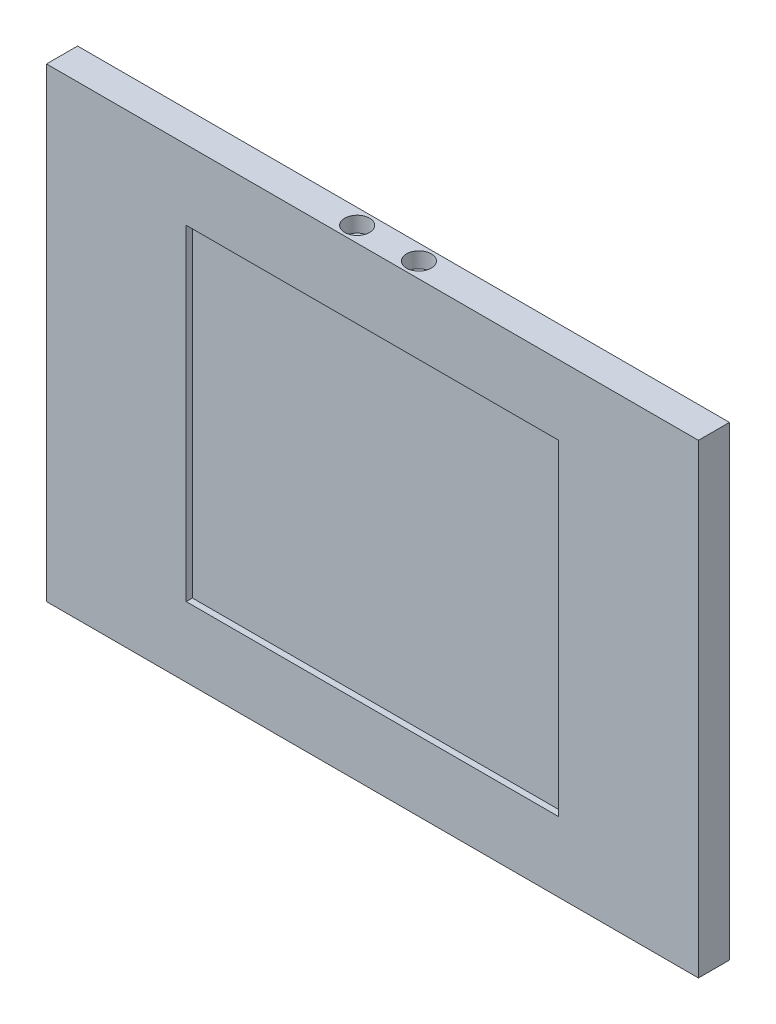
ISO-10303-21;
HEADER;
FILE_DESCRIPTION(('STEP AP214'),'2;1');
FILE_NAME('part.step','',(''),(''),'','','');
FILE_SCHEMA(('AUTOMOTIVE_DESIGN { 1 0 10303 214 1 1 1 1 }'));
ENDSEC;
DATA;
#1=APPLICATION_CONTEXT('core data for automotive mechanical design processes');
#2=APPLICATION_PROTOCOL_DEFINITION('international standard','automotive_design',2000,#1);
#3=PRODUCT_CONTEXT('',#1,'mechanical');
#4=PRODUCT('Part','Part','',(#3));
#5=PRODUCT_RELATED_PRODUCT_CATEGORY('part','',(#4));
#6=PRODUCT_DEFINITION_FORMATION('','',#4);
#7=PRODUCT_DEFINITION_CONTEXT('part definition',#1,'design');
#8=PRODUCT_DEFINITION('design','',#6,#7);
#9=PRODUCT_DEFINITION_SHAPE('','',#8);
#10=(LENGTH_UNIT() NAMED_UNIT(*) SI_UNIT(.MILLI.,.METRE.));
#11=(NAMED_UNIT(*) PLANE_ANGLE_UNIT() SI_UNIT($,.RADIAN.));
#12=(NAMED_UNIT(*) SI_UNIT($,.STERADIAN.) SOLID_ANGLE_UNIT());
#13=UNCERTAINTY_MEASURE_WITH_UNIT(LENGTH_MEASURE(1.E-05),#10,'distance_accuracy_value','');
#14=(GEOMETRIC_REPRESENTATION_CONTEXT(3) GLOBAL_UNCERTAINTY_ASSIGNED_CONTEXT((#13)) GLOBAL_UNIT_ASSIGNED_CONTEXT((#10,
#11,#12)) REPRESENTATION_CONTEXT('',''));
#15=CARTESIAN_POINT('',(0.,0.,0.));
#16=DIRECTION('',(0.,0.,1.));
#17=DIRECTION('',(1.,0.,0.));
#18=AXIS2_PLACEMENT_3D('',#15,#16,#17);
#19=CARTESIAN_POINT('',(105.,-75.,10.));
#20=DIRECTION('',(-1.,0.,0.));
#21=DIRECTION('',(0.,0.,1.));
#22=AXIS2_PLACEMENT_3D('',#19,#20,#21);
#23=PLANE('',#22);
#24=DIRECTION('',(0.,1.,0.));
#25=VECTOR('',#24,1.);
#26=CARTESIAN_POINT('',(105.,-75.,0.));
#27=LINE('',#26,#25);
#28=CARTESIAN_POINT('',(105.,-75.,0.));
#29=VERTEX_POINT('',#28);
#30=CARTESIAN_POINT('',(105.,75.,0.));
#31=VERTEX_POINT('',#30);
#32=EDGE_CURVE('E146',#29,#31,#27,.T.);
#33=ORIENTED_EDGE('',*,*,#32,.T.);
#34=DIRECTION('',(0.,0.,-1.));
#35=VECTOR('',#34,1.);
#36=CARTESIAN_POINT('',(105.,75.,10.));
#37=LINE('',#36,#35);
#38=CARTESIAN_POINT('',(105.,75.,10.));
#39=VERTEX_POINT('',#38);
#40=EDGE_CURVE('E11',#39,#31,#37,.T.);
#41=ORIENTED_EDGE('',*,*,#40,.F.);
#42=DIRECTION('',(0.,1.,0.));
#43=VECTOR('',#42,1.);
#44=CARTESIAN_POINT('',(105.,-75.,10.));
#45=LINE('',#44,#43);
#46=CARTESIAN_POINT('',(105.,-75.,10.));
#47=VERTEX_POINT('',#46);
#48=EDGE_CURVE('E150',#47,#39,#45,.T.);
#49=ORIENTED_EDGE('',*,*,#48,.F.);
#50=DIRECTION('',(0.,0.,-1.));
#51=VECTOR('',#50,1.);
#52=CARTESIAN_POINT('',(105.,-75.,10.));
#53=LINE('',#52,#51);
#54=EDGE_CURVE('E156',#47,#29,#53,.T.);
#55=ORIENTED_EDGE('',*,*,#54,.T.);
#56=EDGE_LOOP('',(#33,#41,#49,#55));
#57=FACE_BOUND('',#56,.T.);
#58=ADVANCED_FACE('F34',(#57),#23,.F.);
#59=CARTESIAN_POINT('',(-105.,75.,10.));
#60=DIRECTION('',(0.,-1.,0.));
#61=DIRECTION('',(0.,0.,-1.));
#62=AXIS2_PLACEMENT_3D('',#59,#60,#61);
#63=PLANE('',#62);
#64=CARTESIAN_POINT('',(9.94275700144992,75.,5.));
#65=DIRECTION('',(0.,1.,0.));
#66=DIRECTION('',(0.,0.,-1.));
#67=AXIS2_PLACEMENT_3D('',#64,#65,#66);
#68=CIRCLE('',#67,4.);
#69=CARTESIAN_POINT('',(9.94275700144992,75.,0.999999999999999));
#70=VERTEX_POINT('',#69);
#71=EDGE_CURVE('E201',#70,#70,#68,.T.);
#72=ORIENTED_EDGE('',*,*,#71,.F.);
#73=EDGE_LOOP('',(#72));
#74=FACE_BOUND('',#73,.T.);
#75=CARTESIAN_POINT('',(-9.94275700144992,75.,5.));
#76=DIRECTION('',(0.,1.,0.));
#77=DIRECTION('',(0.,0.,1.));
#78=AXIS2_PLACEMENT_3D('',#75,#76,#77);
#79=CIRCLE('',#78,4.);
#80=CARTESIAN_POINT('',(-9.94275700144992,75.,9.));
#81=VERTEX_POINT('',#80);
#82=EDGE_CURVE('E133',#81,#81,#79,.T.);
#83=ORIENTED_EDGE('',*,*,#82,.F.);
#84=EDGE_LOOP('',(#83));
#85=FACE_BOUND('',#84,.T.);
#86=DIRECTION('',(-1.,0.,0.));
#87=VECTOR('',#86,1.);
#88=CARTESIAN_POINT('',(-105.,75.,0.));
#89=LINE('',#88,#87);
#90=CARTESIAN_POINT('',(-105.,75.,0.));
#91=VERTEX_POINT('',#90);
#92=EDGE_CURVE('E159',#31,#91,#89,.T.);
#93=ORIENTED_EDGE('',*,*,#92,.T.);
#94=DIRECTION('',(0.,0.,-1.));
#95=VECTOR('',#94,1.);
#96=CARTESIAN_POINT('',(-105.,75.,10.));
#97=LINE('',#96,#95);
#98=CARTESIAN_POINT('',(-105.,75.,10.));
#99=VERTEX_POINT('',#98);
#100=EDGE_CURVE('E41',#99,#91,#97,.T.);
#101=ORIENTED_EDGE('',*,*,#100,.F.);
#102=DIRECTION('',(-1.,0.,0.));
#103=VECTOR('',#102,1.);
#104=CARTESIAN_POINT('',(-105.,75.,10.));
#105=LINE('',#104,#103);
#106=EDGE_CURVE('E85',#39,#99,#105,.T.);
#107=ORIENTED_EDGE('',*,*,#106,.F.);
#108=ORIENTED_EDGE('',*,*,#40,.T.);
#109=EDGE_LOOP('',(#93,#101,#107,#108));
#110=FACE_BOUND('',#109,.T.);
#111=ADVANCED_FACE('F188',(#74,#85,#110),#63,.F.);
#112=CARTESIAN_POINT('',(-105.,-75.,10.));
#113=DIRECTION('',(1.,0.,0.));
#114=DIRECTION('',(0.,0.,-1.));
#115=AXIS2_PLACEMENT_3D('',#112,#113,#114);
#116=PLANE('',#115);
#117=DIRECTION('',(0.,-1.,0.));
#118=VECTOR('',#117,1.);
#119=CARTESIAN_POINT('',(-105.,-75.,0.));
#120=LINE('',#119,#118);
#121=CARTESIAN_POINT('',(-105.,-75.,0.));
#122=VERTEX_POINT('',#121);
#123=EDGE_CURVE('E161',#91,#122,#120,.T.);
#124=ORIENTED_EDGE('',*,*,#123,.T.);
#125=DIRECTION('',(0.,0.,-1.));
#126=VECTOR('',#125,1.);
#127=CARTESIAN_POINT('',(-105.,-75.,10.));
#128=LINE('',#127,#126);
#129=CARTESIAN_POINT('',(-105.,-75.,10.));
#130=VERTEX_POINT('',#129);
#131=EDGE_CURVE('E165',#130,#122,#128,.T.);
#132=ORIENTED_EDGE('',*,*,#131,.F.);
#133=DIRECTION('',(0.,-1.,0.));
#134=VECTOR('',#133,1.);
#135=CARTESIAN_POINT('',(-105.,-75.,10.));
#136=LINE('',#135,#134);
#137=EDGE_CURVE('E153',#99,#130,#136,.T.);
#138=ORIENTED_EDGE('',*,*,#137,.F.);
#139=ORIENTED_EDGE('',*,*,#100,.T.);
#140=EDGE_LOOP('',(#124,#132,#138,#139));
#141=FACE_BOUND('',#140,.T.);
#142=ADVANCED_FACE('F170',(#141),#116,.F.);
#143=CARTESIAN_POINT('',(-105.,-75.,10.));
#144=DIRECTION('',(0.,1.,0.));
#145=DIRECTION('',(0.,0.,1.));
#146=AXIS2_PLACEMENT_3D('',#143,#144,#145);
#147=PLANE('',#146);
#148=DIRECTION('',(1.,0.,0.));
#149=VECTOR('',#148,1.);
#150=CARTESIAN_POINT('',(-105.,-75.,0.));
#151=LINE('',#150,#149);
#152=EDGE_CURVE('E78',#122,#29,#151,.T.);
#153=ORIENTED_EDGE('',*,*,#152,.T.);
#154=ORIENTED_EDGE('',*,*,#54,.F.);
#155=DIRECTION('',(1.,0.,0.));
#156=VECTOR('',#155,1.);
#157=CARTESIAN_POINT('',(-105.,-75.,10.));
#158=LINE('',#157,#156);
#159=EDGE_CURVE('E57',#130,#47,#158,.T.);
#160=ORIENTED_EDGE('',*,*,#159,.F.);
#161=ORIENTED_EDGE('',*,*,#131,.T.);
#162=EDGE_LOOP('',(#153,#154,#160,#161));
#163=FACE_BOUND('',#162,.T.);
#164=ADVANCED_FACE('F178',(#163),#147,.F.);
#165=CARTESIAN_POINT('',(0.,0.,10.));
#166=DIRECTION('',(0.,0.,-1.));
#167=DIRECTION('',(-1.,0.,0.));
#168=AXIS2_PLACEMENT_3D('',#165,#166,#167);
#169=PLANE('',#168);
#170=DIRECTION('',(-1.,0.,0.));
#171=VECTOR('',#170,1.);
#172=CARTESIAN_POINT('',(-60.,52.5,10.));
#173=LINE('',#172,#171);
#174=CARTESIAN_POINT('',(60.,52.5,10.));
#175=VERTEX_POINT('',#174);
#176=CARTESIAN_POINT('',(-60.,52.5,10.));
#177=VERTEX_POINT('',#176);
#178=EDGE_CURVE('E139',#175,#177,#173,.T.);
#179=ORIENTED_EDGE('',*,*,#178,.F.);
#180=DIRECTION('',(0.,1.,0.));
#181=VECTOR('',#180,1.);
#182=CARTESIAN_POINT('',(60.,-52.5,10.));
#183=LINE('',#182,#181);
#184=CARTESIAN_POINT('',(60.,-52.5,10.));
#185=VERTEX_POINT('',#184);
#186=EDGE_CURVE('E48',#185,#175,#183,.T.);
#187=ORIENTED_EDGE('',*,*,#186,.F.);
#188=DIRECTION('',(1.,0.,0.));
#189=VECTOR('',#188,1.);
#190=CARTESIAN_POINT('',(-60.,-52.5,10.));
#191=LINE('',#190,#189);
#192=CARTESIAN_POINT('',(-60.,-52.5,10.));
#193=VERTEX_POINT('',#192);
#194=EDGE_CURVE('E127',#193,#185,#191,.T.);
#195=ORIENTED_EDGE('',*,*,#194,.F.);
#196=DIRECTION('',(0.,-1.,0.));
#197=VECTOR('',#196,1.);
#198=CARTESIAN_POINT('',(-60.,-52.5,10.));
#199=LINE('',#198,#197);
#200=EDGE_CURVE('E130',#177,#193,#199,.T.);
#201=ORIENTED_EDGE('',*,*,#200,.F.);
#202=EDGE_LOOP('',(#179,#187,#195,#201));
#203=FACE_BOUND('',#202,.T.);
#204=ORIENTED_EDGE('',*,*,#48,.T.);
#205=ORIENTED_EDGE('',*,*,#106,.T.);
#206=ORIENTED_EDGE('',*,*,#137,.T.);
#207=ORIENTED_EDGE('',*,*,#159,.T.);
#208=EDGE_LOOP('',(#204,#205,#206,#207));
#209=FACE_BOUND('',#208,.T.);
#210=ADVANCED_FACE('F180',(#203,#209),#169,.F.);
#211=CARTESIAN_POINT('',(0.,0.,0.));
#212=DIRECTION('',(0.,0.,-1.));
#213=DIRECTION('',(-1.,0.,0.));
#214=AXIS2_PLACEMENT_3D('',#211,#212,#213);
#215=PLANE('',#214);
#216=ORIENTED_EDGE('',*,*,#32,.F.);
#217=ORIENTED_EDGE('',*,*,#152,.F.);
#218=ORIENTED_EDGE('',*,*,#123,.F.);
#219=ORIENTED_EDGE('',*,*,#92,.F.);
#220=EDGE_LOOP('',(#216,#217,#218,#219));
#221=FACE_BOUND('',#220,.T.);
#222=ADVANCED_FACE('F174',(#221),#215,.T.);
#223=CARTESIAN_POINT('',(60.,-52.5,8.));
#224=DIRECTION('',(1.,0.,0.));
#225=DIRECTION('',(0.,0.,-1.));
#226=AXIS2_PLACEMENT_3D('',#223,#224,#225);
#227=PLANE('',#226);
#228=ORIENTED_EDGE('',*,*,#186,.T.);
#229=DIRECTION('',(0.,0.,1.));
#230=VECTOR('',#229,1.);
#231=CARTESIAN_POINT('',(60.,52.5,8.));
#232=LINE('',#231,#230);
#233=CARTESIAN_POINT('',(60.,52.5,8.));
#234=VERTEX_POINT('',#233);
#235=EDGE_CURVE('E105',#234,#175,#232,.T.);
#236=ORIENTED_EDGE('',*,*,#235,.F.);
#237=DIRECTION('',(0.,1.,0.));
#238=VECTOR('',#237,1.);
#239=CARTESIAN_POINT('',(60.,-52.5,8.));
#240=LINE('',#239,#238);
#241=CARTESIAN_POINT('',(60.,-52.5,8.));
#242=VERTEX_POINT('',#241);
#243=EDGE_CURVE('E109',#242,#234,#240,.T.);
#244=ORIENTED_EDGE('',*,*,#243,.F.);
#245=DIRECTION('',(0.,0.,1.));
#246=VECTOR('',#245,1.);
#247=CARTESIAN_POINT('',(60.,-52.5,8.));
#248=LINE('',#247,#246);
#249=EDGE_CURVE('E144',#242,#185,#248,.T.);
#250=ORIENTED_EDGE('',*,*,#249,.T.);
#251=EDGE_LOOP('',(#228,#236,#244,#250));
#252=FACE_BOUND('',#251,.T.);
#253=ADVANCED_FACE('F107',(#252),#227,.F.);
#254=CARTESIAN_POINT('',(-60.,-52.5,8.));
#255=DIRECTION('',(0.,-1.,0.));
#256=DIRECTION('',(0.,0.,-1.));
#257=AXIS2_PLACEMENT_3D('',#254,#255,#256);
#258=PLANE('',#257);
#259=ORIENTED_EDGE('',*,*,#194,.T.);
#260=ORIENTED_EDGE('',*,*,#249,.F.);
#261=DIRECTION('',(1.,0.,0.));
#262=VECTOR('',#261,1.);
#263=CARTESIAN_POINT('',(-60.,-52.5,8.));
#264=LINE('',#263,#262);
#265=CARTESIAN_POINT('',(-60.,-52.5,8.));
#266=VERTEX_POINT('',#265);
#267=EDGE_CURVE('E115',#266,#242,#264,.T.);
#268=ORIENTED_EDGE('',*,*,#267,.F.);
#269=DIRECTION('',(0.,0.,1.));
#270=VECTOR('',#269,1.);
#271=CARTESIAN_POINT('',(-60.,-52.5,8.));
#272=LINE('',#271,#270);
#273=EDGE_CURVE('E147',#266,#193,#272,.T.);
#274=ORIENTED_EDGE('',*,*,#273,.T.);
#275=EDGE_LOOP('',(#259,#260,#268,#274));
#276=FACE_BOUND('',#275,.T.);
#277=ADVANCED_FACE('F233',(#276),#258,.F.);
#278=CARTESIAN_POINT('',(-60.,-52.5,8.));
#279=DIRECTION('',(-1.,0.,0.));
#280=DIRECTION('',(0.,0.,1.));
#281=AXIS2_PLACEMENT_3D('',#278,#279,#280);
#282=PLANE('',#281);
#283=ORIENTED_EDGE('',*,*,#200,.T.);
#284=ORIENTED_EDGE('',*,*,#273,.F.);
#285=DIRECTION('',(0.,-1.,0.));
#286=VECTOR('',#285,1.);
#287=CARTESIAN_POINT('',(-60.,-52.5,8.));
#288=LINE('',#287,#286);
#289=CARTESIAN_POINT('',(-60.,52.5,8.));
#290=VERTEX_POINT('',#289);
#291=EDGE_CURVE('E123',#290,#266,#288,.T.);
#292=ORIENTED_EDGE('',*,*,#291,.F.);
#293=DIRECTION('',(0.,0.,1.));
#294=VECTOR('',#293,1.);
#295=CARTESIAN_POINT('',(-60.,52.5,8.));
#296=LINE('',#295,#294);
#297=EDGE_CURVE('E114',#290,#177,#296,.T.);
#298=ORIENTED_EDGE('',*,*,#297,.T.);
#299=EDGE_LOOP('',(#283,#284,#292,#298));
#300=FACE_BOUND('',#299,.T.);
#301=ADVANCED_FACE('F236',(#300),#282,.F.);
#302=CARTESIAN_POINT('',(-60.,52.5,8.));
#303=DIRECTION('',(0.,1.,0.));
#304=DIRECTION('',(0.,0.,1.));
#305=AXIS2_PLACEMENT_3D('',#302,#303,#304);
#306=PLANE('',#305);
#307=ORIENTED_EDGE('',*,*,#178,.T.);
#308=ORIENTED_EDGE('',*,*,#297,.F.);
#309=DIRECTION('',(-1.,0.,0.));
#310=VECTOR('',#309,1.);
#311=CARTESIAN_POINT('',(-60.,52.5,8.));
#312=LINE('',#311,#310);
#313=EDGE_CURVE('E118',#234,#290,#312,.T.);
#314=ORIENTED_EDGE('',*,*,#313,.F.);
#315=ORIENTED_EDGE('',*,*,#235,.T.);
#316=EDGE_LOOP('',(#307,#308,#314,#315));
#317=FACE_BOUND('',#316,.T.);
#318=ADVANCED_FACE('F119',(#317),#306,.F.);
#319=CARTESIAN_POINT('',(0.,0.,8.));
#320=DIRECTION('',(0.,0.,-1.));
#321=DIRECTION('',(-1.,0.,0.));
#322=AXIS2_PLACEMENT_3D('',#319,#320,#321);
#323=PLANE('',#322);
#324=ORIENTED_EDGE('',*,*,#243,.T.);
#325=ORIENTED_EDGE('',*,*,#313,.T.);
#326=ORIENTED_EDGE('',*,*,#291,.T.);
#327=ORIENTED_EDGE('',*,*,#267,.T.);
#328=EDGE_LOOP('',(#324,#325,#326,#327));
#329=FACE_BOUND('',#328,.T.);
#330=ADVANCED_FACE('F125',(#329),#323,.F.);
#331=CARTESIAN_POINT('',(-9.94275700144992,70.,5.));
#332=DIRECTION('',(0.,1.,0.));
#333=DIRECTION('',(0.,0.,1.));
#334=AXIS2_PLACEMENT_3D('',#331,#332,#333);
#335=CYLINDRICAL_SURFACE('',#334,4.);
#336=CARTESIAN_POINT('',(-9.94275700144992,70.,5.));
#337=DIRECTION('',(0.,1.,0.));
#338=DIRECTION('',(0.,0.,1.));
#339=AXIS2_PLACEMENT_3D('',#336,#337,#338);
#340=CIRCLE('',#339,4.);
#341=CARTESIAN_POINT('',(-9.94275700144992,70.,9.));
#342=VERTEX_POINT('',#341);
#343=EDGE_CURVE('E140',#342,#342,#340,.T.);
#344=ORIENTED_EDGE('',*,*,#343,.F.);
#345=EDGE_LOOP('',(#344));
#346=FACE_BOUND('',#345,.T.);
#347=ORIENTED_EDGE('',*,*,#82,.T.);
#348=EDGE_LOOP('',(#347));
#349=FACE_BOUND('',#348,.T.);
#350=ADVANCED_FACE('F224',(#346,#349),#335,.F.);
#351=CARTESIAN_POINT('',(-9.94275700144992,70.,5.));
#352=DIRECTION('',(0.,1.,0.));
#353=DIRECTION('',(0.,0.,1.));
#354=AXIS2_PLACEMENT_3D('',#351,#352,#353);
#355=PLANE('',#354);
#356=ORIENTED_EDGE('',*,*,#343,.T.);
#357=EDGE_LOOP('',(#356));
#358=FACE_BOUND('',#357,.T.);
#359=ADVANCED_FACE('F216',(#358),#355,.T.);
#360=CARTESIAN_POINT('',(9.94275700144992,70.,5.));
#361=DIRECTION('',(0.,1.,0.));
#362=DIRECTION('',(0.,0.,1.));
#363=AXIS2_PLACEMENT_3D('',#360,#361,#362);
#364=CYLINDRICAL_SURFACE('',#363,4.);
#365=CARTESIAN_POINT('',(9.94275700144992,70.,5.));
#366=DIRECTION('',(0.,1.,0.));
#367=DIRECTION('',(0.,0.,-1.));
#368=AXIS2_PLACEMENT_3D('',#365,#366,#367);
#369=CIRCLE('',#368,4.);
#370=CARTESIAN_POINT('',(9.94275700144992,70.,0.999999999999999));
#371=VERTEX_POINT('',#370);
#372=EDGE_CURVE('E205',#371,#371,#369,.T.);
#373=ORIENTED_EDGE('',*,*,#372,.F.);
#374=EDGE_LOOP('',(#373));
#375=FACE_BOUND('',#374,.T.);
#376=ORIENTED_EDGE('',*,*,#71,.T.);
#377=EDGE_LOOP('',(#376));
#378=FACE_BOUND('',#377,.T.);
#379=ADVANCED_FACE('F213',(#375,#378),#364,.F.);
#380=CARTESIAN_POINT('',(9.94275700144992,70.,5.));
#381=DIRECTION('',(0.,-1.,0.));
#382=DIRECTION('',(0.,0.,-1.));
#383=AXIS2_PLACEMENT_3D('',#380,#381,#382);
#384=PLANE('',#383);
#385=ORIENTED_EDGE('',*,*,#372,.T.);
#386=EDGE_LOOP('',(#385));
#387=FACE_BOUND('',#386,.T.);
#388=ADVANCED_FACE('F215',(#387),#384,.F.);
#389=CLOSED_SHELL('',(#58,#111,#142,#164,#210,#222,#253,#277,#301,#318,#330,#350,#359,#379,#388));
#390=MANIFOLD_SOLID_BREP('B2',#389);
#391=ADVANCED_BREP_SHAPE_REPRESENTATION('',(#18,#390),#14);
#392=SHAPE_DEFINITION_REPRESENTATION(#9,#391);
ENDSEC;
END-ISO-10303-21;
